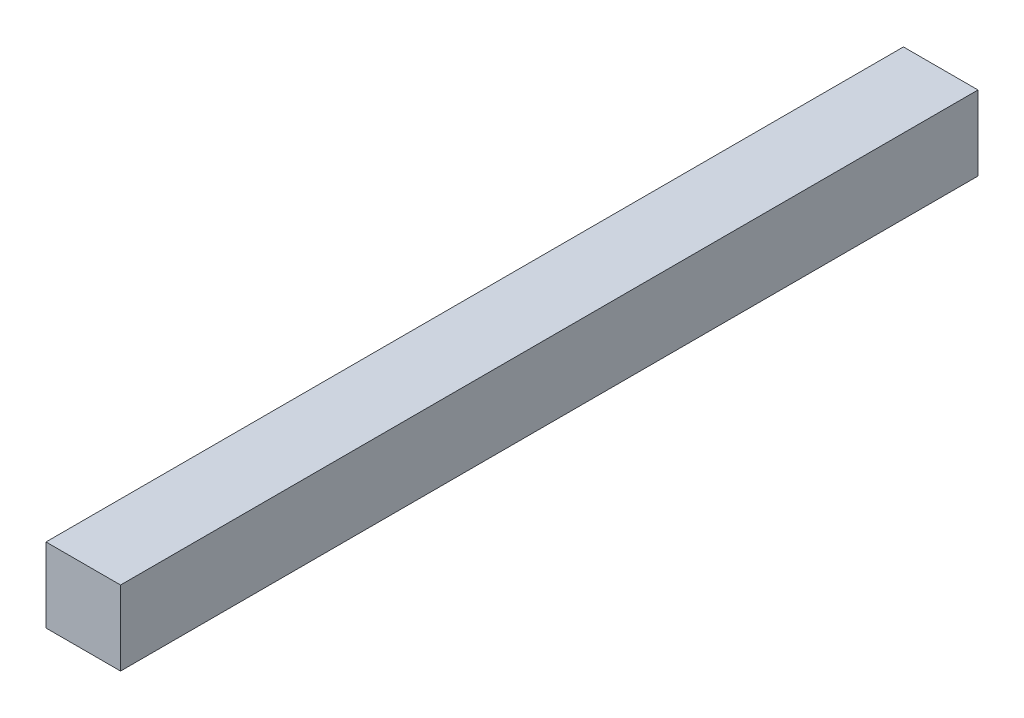
ISO-10303-21;
HEADER;
FILE_DESCRIPTION(('STEP AP214'),'2;1');
FILE_NAME('part.step','',(''),(''),'','','');
FILE_SCHEMA(('AUTOMOTIVE_DESIGN { 1 0 10303 214 1 1 1 1 }'));
ENDSEC;
DATA;
#1=APPLICATION_CONTEXT('core data for automotive mechanical design processes');
#2=APPLICATION_PROTOCOL_DEFINITION('international standard','automotive_design',2000,#1);
#3=PRODUCT_CONTEXT('',#1,'mechanical');
#4=PRODUCT('Part','Part','',(#3));
#5=PRODUCT_RELATED_PRODUCT_CATEGORY('part','',(#4));
#6=PRODUCT_DEFINITION_FORMATION('','',#4);
#7=PRODUCT_DEFINITION_CONTEXT('part definition',#1,'design');
#8=PRODUCT_DEFINITION('design','',#6,#7);
#9=PRODUCT_DEFINITION_SHAPE('','',#8);
#10=(LENGTH_UNIT() NAMED_UNIT(*) SI_UNIT(.MILLI.,.METRE.));
#11=(NAMED_UNIT(*) PLANE_ANGLE_UNIT() SI_UNIT($,.RADIAN.));
#12=(NAMED_UNIT(*) SI_UNIT($,.STERADIAN.) SOLID_ANGLE_UNIT());
#13=UNCERTAINTY_MEASURE_WITH_UNIT(LENGTH_MEASURE(1.E-05),#10,'distance_accuracy_value','');
#14=(GEOMETRIC_REPRESENTATION_CONTEXT(3) GLOBAL_UNCERTAINTY_ASSIGNED_CONTEXT((#13)) GLOBAL_UNIT_ASSIGNED_CONTEXT((#10,
#11,#12)) REPRESENTATION_CONTEXT('',''));
#15=CARTESIAN_POINT('',(0.,0.,0.));
#16=DIRECTION('',(0.,0.,1.));
#17=DIRECTION('',(1.,0.,0.));
#18=AXIS2_PLACEMENT_3D('',#15,#16,#17);
#19=CARTESIAN_POINT('',(0.,0.,230.));
#20=DIRECTION('',(1.,0.,0.));
#21=DIRECTION('',(0.,0.,-1.));
#22=AXIS2_PLACEMENT_3D('',#19,#20,#21);
#23=PLANE('',#22);
#24=DIRECTION('',(0.,-1.,0.));
#25=VECTOR('',#24,1.);
#26=CARTESIAN_POINT('',(0.,0.,0.));
#27=LINE('',#26,#25);
#28=CARTESIAN_POINT('',(0.,0.,0.));
#29=VERTEX_POINT('',#28);
#30=CARTESIAN_POINT('',(0.,-20.,0.));
#31=VERTEX_POINT('',#30);
#32=EDGE_CURVE('E96',#29,#31,#27,.T.);
#33=ORIENTED_EDGE('',*,*,#32,.T.);
#34=DIRECTION('',(0.,0.,-1.));
#35=VECTOR('',#34,1.);
#36=CARTESIAN_POINT('',(0.,-20.,230.));
#37=LINE('',#36,#35);
#38=CARTESIAN_POINT('',(0.,-20.,230.));
#39=VERTEX_POINT('',#38);
#40=EDGE_CURVE('E11',#39,#31,#37,.T.);
#41=ORIENTED_EDGE('',*,*,#40,.F.);
#42=DIRECTION('',(0.,-1.,0.));
#43=VECTOR('',#42,1.);
#44=CARTESIAN_POINT('',(0.,0.,230.));
#45=LINE('',#44,#43);
#46=CARTESIAN_POINT('',(0.,0.,230.));
#47=VERTEX_POINT('',#46);
#48=EDGE_CURVE('E84',#47,#39,#45,.T.);
#49=ORIENTED_EDGE('',*,*,#48,.F.);
#50=DIRECTION('',(0.,0.,-1.));
#51=VECTOR('',#50,1.);
#52=CARTESIAN_POINT('',(0.,0.,230.));
#53=LINE('',#52,#51);
#54=EDGE_CURVE('E92',#47,#29,#53,.T.);
#55=ORIENTED_EDGE('',*,*,#54,.T.);
#56=EDGE_LOOP('',(#33,#41,#49,#55));
#57=FACE_BOUND('',#56,.T.);
#58=ADVANCED_FACE('F33',(#57),#23,.F.);
#59=CARTESIAN_POINT('',(0.,-20.,230.));
#60=DIRECTION('',(0.,1.,0.));
#61=DIRECTION('',(0.,0.,1.));
#62=AXIS2_PLACEMENT_3D('',#59,#60,#61);
#63=PLANE('',#62);
#64=DIRECTION('',(1.,0.,0.));
#65=VECTOR('',#64,1.);
#66=CARTESIAN_POINT('',(0.,-20.,0.));
#67=LINE('',#66,#65);
#68=CARTESIAN_POINT('',(20.,-20.,0.));
#69=VERTEX_POINT('',#68);
#70=EDGE_CURVE('E88',#31,#69,#67,.T.);
#71=ORIENTED_EDGE('',*,*,#70,.T.);
#72=DIRECTION('',(0.,0.,-1.));
#73=VECTOR('',#72,1.);
#74=CARTESIAN_POINT('',(20.,-20.,230.));
#75=LINE('',#74,#73);
#76=CARTESIAN_POINT('',(20.,-20.,230.));
#77=VERTEX_POINT('',#76);
#78=EDGE_CURVE('E41',#77,#69,#75,.T.);
#79=ORIENTED_EDGE('',*,*,#78,.F.);
#80=DIRECTION('',(1.,0.,0.));
#81=VECTOR('',#80,1.);
#82=CARTESIAN_POINT('',(0.,-20.,230.));
#83=LINE('',#82,#81);
#84=EDGE_CURVE('E79',#39,#77,#83,.T.);
#85=ORIENTED_EDGE('',*,*,#84,.F.);
#86=ORIENTED_EDGE('',*,*,#40,.T.);
#87=EDGE_LOOP('',(#71,#79,#85,#86));
#88=FACE_BOUND('',#87,.T.);
#89=ADVANCED_FACE('F87',(#88),#63,.F.);
#90=CARTESIAN_POINT('',(20.,0.,230.));
#91=DIRECTION('',(-1.,0.,0.));
#92=DIRECTION('',(0.,-1.,0.));
#93=AXIS2_PLACEMENT_3D('',#90,#91,#92);
#94=PLANE('',#93);
#95=DIRECTION('',(0.,1.,0.));
#96=VECTOR('',#95,1.);
#97=CARTESIAN_POINT('',(20.,0.,0.));
#98=LINE('',#97,#96);
#99=CARTESIAN_POINT('',(20.,0.,0.));
#100=VERTEX_POINT('',#99);
#101=EDGE_CURVE('E66',#69,#100,#98,.T.);
#102=ORIENTED_EDGE('',*,*,#101,.T.);
#103=DIRECTION('',(0.,0.,-1.));
#104=VECTOR('',#103,1.);
#105=CARTESIAN_POINT('',(20.,0.,230.));
#106=LINE('',#105,#104);
#107=CARTESIAN_POINT('',(20.,0.,230.));
#108=VERTEX_POINT('',#107);
#109=EDGE_CURVE('E89',#108,#100,#106,.T.);
#110=ORIENTED_EDGE('',*,*,#109,.F.);
#111=DIRECTION('',(0.,1.,0.));
#112=VECTOR('',#111,1.);
#113=CARTESIAN_POINT('',(20.,0.,230.));
#114=LINE('',#113,#112);
#115=EDGE_CURVE('E82',#77,#108,#114,.T.);
#116=ORIENTED_EDGE('',*,*,#115,.F.);
#117=ORIENTED_EDGE('',*,*,#78,.T.);
#118=EDGE_LOOP('',(#102,#110,#116,#117));
#119=FACE_BOUND('',#118,.T.);
#120=ADVANCED_FACE('F90',(#119),#94,.F.);
#121=CARTESIAN_POINT('',(0.,0.,230.));
#122=DIRECTION('',(0.,-1.,0.));
#123=DIRECTION('',(0.,0.,-1.));
#124=AXIS2_PLACEMENT_3D('',#121,#122,#123);
#125=PLANE('',#124);
#126=DIRECTION('',(-1.,0.,0.));
#127=VECTOR('',#126,1.);
#128=CARTESIAN_POINT('',(0.,0.,0.));
#129=LINE('',#128,#127);
#130=EDGE_CURVE('E72',#100,#29,#129,.T.);
#131=ORIENTED_EDGE('',*,*,#130,.T.);
#132=ORIENTED_EDGE('',*,*,#54,.F.);
#133=DIRECTION('',(-1.,0.,0.));
#134=VECTOR('',#133,1.);
#135=CARTESIAN_POINT('',(0.,0.,230.));
#136=LINE('',#135,#134);
#137=EDGE_CURVE('E49',#108,#47,#136,.T.);
#138=ORIENTED_EDGE('',*,*,#137,.F.);
#139=ORIENTED_EDGE('',*,*,#109,.T.);
#140=EDGE_LOOP('',(#131,#132,#138,#139));
#141=FACE_BOUND('',#140,.T.);
#142=ADVANCED_FACE('F103',(#141),#125,.F.);
#143=CARTESIAN_POINT('',(0.,0.,230.));
#144=DIRECTION('',(0.,0.,1.));
#145=DIRECTION('',(1.,0.,0.));
#146=AXIS2_PLACEMENT_3D('',#143,#144,#145);
#147=PLANE('',#146);
#148=ORIENTED_EDGE('',*,*,#48,.T.);
#149=ORIENTED_EDGE('',*,*,#84,.T.);
#150=ORIENTED_EDGE('',*,*,#115,.T.);
#151=ORIENTED_EDGE('',*,*,#137,.T.);
#152=EDGE_LOOP('',(#148,#149,#150,#151));
#153=FACE_BOUND('',#152,.T.);
#154=ADVANCED_FACE('F80',(#153),#147,.T.);
#155=CARTESIAN_POINT('',(0.,0.,0.));
#156=DIRECTION('',(0.,0.,1.));
#157=DIRECTION('',(1.,0.,0.));
#158=AXIS2_PLACEMENT_3D('',#155,#156,#157);
#159=PLANE('',#158);
#160=ORIENTED_EDGE('',*,*,#32,.F.);
#161=ORIENTED_EDGE('',*,*,#130,.F.);
#162=ORIENTED_EDGE('',*,*,#101,.F.);
#163=ORIENTED_EDGE('',*,*,#70,.F.);
#164=EDGE_LOOP('',(#160,#161,#162,#163));
#165=FACE_BOUND('',#164,.T.);
#166=ADVANCED_FACE('F106',(#165),#159,.F.);
#167=CLOSED_SHELL('',(#58,#89,#120,#142,#154,#166));
#168=MANIFOLD_SOLID_BREP('B2',#167);
#169=ADVANCED_BREP_SHAPE_REPRESENTATION('',(#18,#168),#14);
#170=SHAPE_DEFINITION_REPRESENTATION(#9,#169);
ENDSEC;
END-ISO-10303-21;
